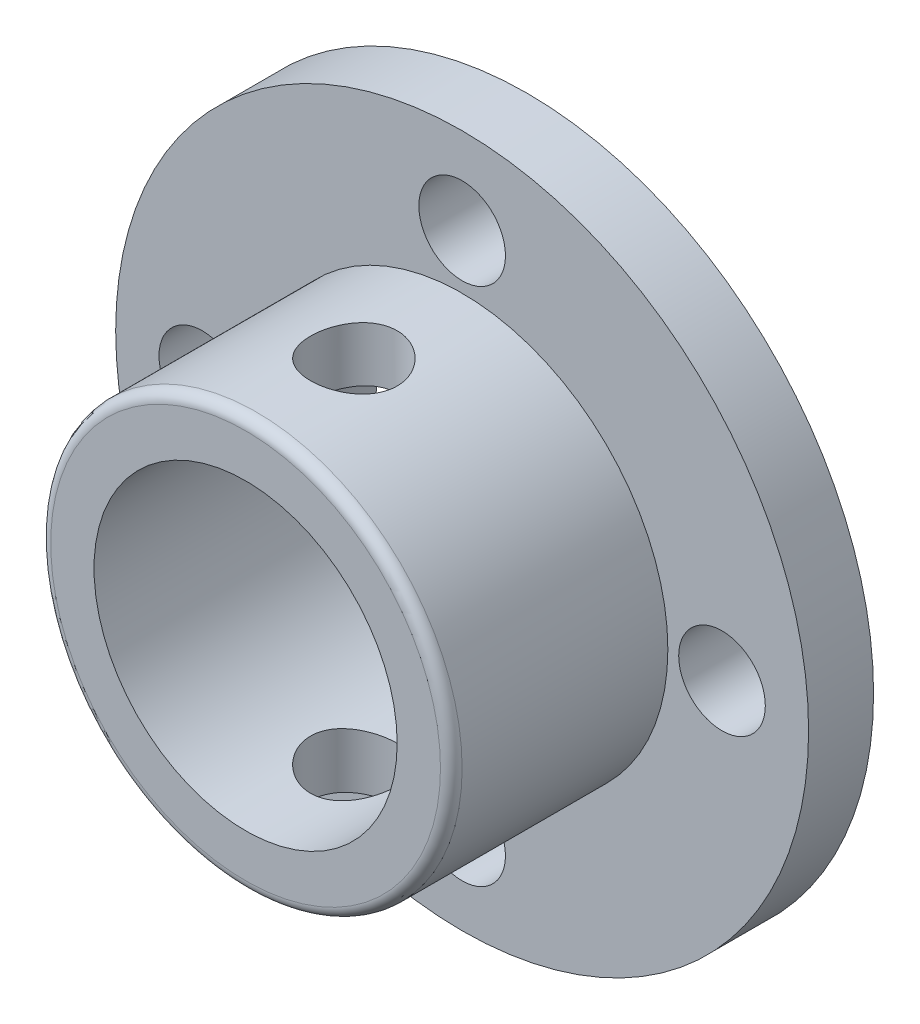
ISO-10303-21;
HEADER;
FILE_DESCRIPTION(('STEP AP214'),'2;1');
FILE_NAME('part.step','',(''),(''),'','','');
FILE_SCHEMA(('AUTOMOTIVE_DESIGN { 1 0 10303 214 1 1 1 1 }'));
ENDSEC;
DATA;
#1=APPLICATION_CONTEXT('core data for automotive mechanical design processes');
#2=APPLICATION_PROTOCOL_DEFINITION('international standard','automotive_design',2000,#1);
#3=PRODUCT_CONTEXT('',#1,'mechanical');
#4=PRODUCT('Part','Part','',(#3));
#5=PRODUCT_RELATED_PRODUCT_CATEGORY('part','',(#4));
#6=PRODUCT_DEFINITION_FORMATION('','',#4);
#7=PRODUCT_DEFINITION_CONTEXT('part definition',#1,'design');
#8=PRODUCT_DEFINITION('design','',#6,#7);
#9=PRODUCT_DEFINITION_SHAPE('','',#8);
#10=(LENGTH_UNIT() NAMED_UNIT(*) SI_UNIT(.MILLI.,.METRE.));
#11=(NAMED_UNIT(*) PLANE_ANGLE_UNIT() SI_UNIT($,.RADIAN.));
#12=(NAMED_UNIT(*) SI_UNIT($,.STERADIAN.) SOLID_ANGLE_UNIT());
#13=UNCERTAINTY_MEASURE_WITH_UNIT(LENGTH_MEASURE(1.E-05),#10,'distance_accuracy_value','');
#14=(GEOMETRIC_REPRESENTATION_CONTEXT(3) GLOBAL_UNCERTAINTY_ASSIGNED_CONTEXT((#13)) GLOBAL_UNIT_ASSIGNED_CONTEXT((#10,
#11,#12)) REPRESENTATION_CONTEXT('',''));
#15=CARTESIAN_POINT('',(0.,0.,0.));
#16=DIRECTION('',(0.,0.,1.));
#17=DIRECTION('',(1.,0.,0.));
#18=AXIS2_PLACEMENT_3D('',#15,#16,#17);
#19=CARTESIAN_POINT('',(0.,0.,3.));
#20=DIRECTION('',(0.,0.,-1.));
#21=DIRECTION('',(-1.,0.,0.));
#22=AXIS2_PLACEMENT_3D('',#19,#20,#21);
#23=CYLINDRICAL_SURFACE('',#22,16.);
#24=CARTESIAN_POINT('',(0.,0.,3.));
#25=DIRECTION('',(0.,0.,1.));
#26=DIRECTION('',(1.,0.,0.));
#27=AXIS2_PLACEMENT_3D('',#24,#25,#26);
#28=CIRCLE('',#27,16.);
#29=CARTESIAN_POINT('',(16.,0.,3.));
#30=VERTEX_POINT('',#29);
#31=EDGE_CURVE('E52',#30,#30,#28,.T.);
#32=ORIENTED_EDGE('',*,*,#31,.F.);
#33=EDGE_LOOP('',(#32));
#34=FACE_BOUND('',#33,.T.);
#35=CARTESIAN_POINT('',(0.,0.,0.));
#36=DIRECTION('',(0.,0.,1.));
#37=DIRECTION('',(1.,0.,0.));
#38=AXIS2_PLACEMENT_3D('',#35,#36,#37);
#39=CIRCLE('',#38,16.);
#40=CARTESIAN_POINT('',(16.,0.,0.));
#41=VERTEX_POINT('',#40);
#42=EDGE_CURVE('E118',#41,#41,#39,.T.);
#43=ORIENTED_EDGE('',*,*,#42,.T.);
#44=EDGE_LOOP('',(#43));
#45=FACE_BOUND('',#44,.T.);
#46=ADVANCED_FACE('F37',(#34,#45),#23,.T.);
#47=CARTESIAN_POINT('',(0.,0.,3.));
#48=DIRECTION('',(0.,0.,1.));
#49=DIRECTION('',(1.,0.,0.));
#50=AXIS2_PLACEMENT_3D('',#47,#48,#49);
#51=PLANE('',#50);
#52=CARTESIAN_POINT('',(-12.,0.,3.));
#53=DIRECTION('',(0.,0.,1.));
#54=DIRECTION('',(1.,0.,0.));
#55=AXIS2_PLACEMENT_3D('',#52,#53,#54);
#56=CIRCLE('',#55,2.);
#57=CARTESIAN_POINT('',(-10.,0.,3.));
#58=VERTEX_POINT('',#57);
#59=EDGE_CURVE('E127',#58,#58,#56,.T.);
#60=ORIENTED_EDGE('',*,*,#59,.F.);
#61=EDGE_LOOP('',(#60));
#62=FACE_BOUND('',#61,.T.);
#63=CARTESIAN_POINT('',(0.,-12.,3.));
#64=DIRECTION('',(0.,0.,1.));
#65=DIRECTION('',(1.,0.,0.));
#66=AXIS2_PLACEMENT_3D('',#63,#64,#65);
#67=CIRCLE('',#66,2.);
#68=CARTESIAN_POINT('',(2.,-12.,3.));
#69=VERTEX_POINT('',#68);
#70=EDGE_CURVE('E131',#69,#69,#67,.T.);
#71=ORIENTED_EDGE('',*,*,#70,.F.);
#72=EDGE_LOOP('',(#71));
#73=FACE_BOUND('',#72,.T.);
#74=CARTESIAN_POINT('',(12.,0.,3.));
#75=DIRECTION('',(0.,0.,1.));
#76=DIRECTION('',(1.,0.,0.));
#77=AXIS2_PLACEMENT_3D('',#74,#75,#76);
#78=CIRCLE('',#77,2.);
#79=CARTESIAN_POINT('',(14.,0.,3.));
#80=VERTEX_POINT('',#79);
#81=EDGE_CURVE('E134',#80,#80,#78,.T.);
#82=ORIENTED_EDGE('',*,*,#81,.F.);
#83=EDGE_LOOP('',(#82));
#84=FACE_BOUND('',#83,.T.);
#85=CARTESIAN_POINT('',(0.,12.,3.));
#86=DIRECTION('',(0.,0.,1.));
#87=DIRECTION('',(1.,0.,0.));
#88=AXIS2_PLACEMENT_3D('',#85,#86,#87);
#89=CIRCLE('',#88,2.);
#90=CARTESIAN_POINT('',(2.,12.,3.));
#91=VERTEX_POINT('',#90);
#92=EDGE_CURVE('E137',#91,#91,#89,.T.);
#93=ORIENTED_EDGE('',*,*,#92,.F.);
#94=EDGE_LOOP('',(#93));
#95=FACE_BOUND('',#94,.T.);
#96=CARTESIAN_POINT('',(0.,0.,3.));
#97=DIRECTION('',(0.,0.,1.));
#98=DIRECTION('',(1.,0.,0.));
#99=AXIS2_PLACEMENT_3D('',#96,#97,#98);
#100=CIRCLE('',#99,9.5);
#101=CARTESIAN_POINT('',(9.5,0.,3.));
#102=VERTEX_POINT('',#101);
#103=EDGE_CURVE('E48',#102,#102,#100,.T.);
#104=ORIENTED_EDGE('',*,*,#103,.F.);
#105=EDGE_LOOP('',(#104));
#106=FACE_BOUND('',#105,.T.);
#107=ORIENTED_EDGE('',*,*,#31,.T.);
#108=EDGE_LOOP('',(#107));
#109=FACE_BOUND('',#108,.T.);
#110=ADVANCED_FACE('F102',(#62,#73,#84,#95,#106,#109),#51,.T.);
#111=CARTESIAN_POINT('',(0.,0.,0.));
#112=DIRECTION('',(0.,0.,1.));
#113=DIRECTION('',(1.,0.,0.));
#114=AXIS2_PLACEMENT_3D('',#111,#112,#113);
#115=PLANE('',#114);
#116=CARTESIAN_POINT('',(-12.,0.,0.));
#117=DIRECTION('',(0.,0.,-1.));
#118=DIRECTION('',(-1.,0.,0.));
#119=AXIS2_PLACEMENT_3D('',#116,#117,#118);
#120=CIRCLE('',#119,2.);
#121=CARTESIAN_POINT('',(-14.,0.,0.));
#122=VERTEX_POINT('',#121);
#123=EDGE_CURVE('E140',#122,#122,#120,.T.);
#124=ORIENTED_EDGE('',*,*,#123,.F.);
#125=EDGE_LOOP('',(#124));
#126=FACE_BOUND('',#125,.T.);
#127=CARTESIAN_POINT('',(0.,-12.,0.));
#128=DIRECTION('',(0.,0.,-1.));
#129=DIRECTION('',(-1.,0.,0.));
#130=AXIS2_PLACEMENT_3D('',#127,#128,#129);
#131=CIRCLE('',#130,2.);
#132=CARTESIAN_POINT('',(-2.,-12.,0.));
#133=VERTEX_POINT('',#132);
#134=EDGE_CURVE('E147',#133,#133,#131,.T.);
#135=ORIENTED_EDGE('',*,*,#134,.F.);
#136=EDGE_LOOP('',(#135));
#137=FACE_BOUND('',#136,.T.);
#138=CARTESIAN_POINT('',(12.,0.,0.));
#139=DIRECTION('',(0.,0.,-1.));
#140=DIRECTION('',(-1.,0.,0.));
#141=AXIS2_PLACEMENT_3D('',#138,#139,#140);
#142=CIRCLE('',#141,2.);
#143=CARTESIAN_POINT('',(10.,0.,0.));
#144=VERTEX_POINT('',#143);
#145=EDGE_CURVE('E144',#144,#144,#142,.T.);
#146=ORIENTED_EDGE('',*,*,#145,.F.);
#147=EDGE_LOOP('',(#146));
#148=FACE_BOUND('',#147,.T.);
#149=CARTESIAN_POINT('',(0.,12.,0.));
#150=DIRECTION('',(0.,0.,-1.));
#151=DIRECTION('',(-1.,0.,0.));
#152=AXIS2_PLACEMENT_3D('',#149,#150,#151);
#153=CIRCLE('',#152,2.);
#154=CARTESIAN_POINT('',(-2.,12.,0.));
#155=VERTEX_POINT('',#154);
#156=EDGE_CURVE('E141',#155,#155,#153,.T.);
#157=ORIENTED_EDGE('',*,*,#156,.F.);
#158=EDGE_LOOP('',(#157));
#159=FACE_BOUND('',#158,.T.);
#160=CARTESIAN_POINT('',(0.,0.,0.));
#161=DIRECTION('',(0.,0.,1.));
#162=DIRECTION('',(1.,0.,0.));
#163=AXIS2_PLACEMENT_3D('',#160,#161,#162);
#164=CIRCLE('',#163,7.);
#165=CARTESIAN_POINT('',(7.,0.,0.));
#166=VERTEX_POINT('',#165);
#167=EDGE_CURVE('E120',#166,#166,#164,.T.);
#168=ORIENTED_EDGE('',*,*,#167,.T.);
#169=EDGE_LOOP('',(#168));
#170=FACE_BOUND('',#169,.T.);
#171=ORIENTED_EDGE('',*,*,#42,.F.);
#172=EDGE_LOOP('',(#171));
#173=FACE_BOUND('',#172,.T.);
#174=ADVANCED_FACE('F101',(#126,#137,#148,#159,#170,#173),#115,.F.);
#175=CARTESIAN_POINT('',(0.,0.,13.));
#176=DIRECTION('',(0.,0.,-1.));
#177=DIRECTION('',(-1.,0.,0.));
#178=AXIS2_PLACEMENT_3D('',#175,#176,#177);
#179=CYLINDRICAL_SURFACE('',#178,9.5);
#180=CARTESIAN_POINT('',(0.,0.,12.5));
#181=DIRECTION('',(0.,0.,1.));
#182=DIRECTION('',(1.,0.,0.));
#183=AXIS2_PLACEMENT_3D('',#180,#181,#182);
#184=CIRCLE('',#183,9.5);
#185=CARTESIAN_POINT('',(9.5,0.,12.5));
#186=VERTEX_POINT('',#185);
#187=EDGE_CURVE('E10',#186,#186,#184,.F.);
#188=ORIENTED_EDGE('',*,*,#187,.T.);
#189=EDGE_LOOP('',(#188));
#190=FACE_BOUND('',#189,.T.);
#191=CARTESIAN_POINT('',(0.,-9.5,10.));
#192=CARTESIAN_POINT('',(0.111027691406918,-9.49999794466284,9.99999607124184));
#193=CARTESIAN_POINT('',(0.222103819697907,-9.49803374011152,9.99072341258494));
#194=CARTESIAN_POINT('',(0.441107897677741,-9.49038773876543,9.95391221577523));
#195=CARTESIAN_POINT('',(0.54903342154803,-9.48470315241122,9.92635997129166));
#196=CARTESIAN_POINT('',(0.75853895435663,-9.47025014436966,9.85388532469073));
#197=CARTESIAN_POINT('',(0.860125227252473,-9.46148482551806,9.80898039524809));
#198=CARTESIAN_POINT('',(1.05431669556347,-9.44181943917345,9.7031289600956));
#199=CARTESIAN_POINT('',(1.14692225767425,-9.43091945889674,9.64218310973783));
#200=CARTESIAN_POINT('',(1.32191105664779,-9.40799939900276,9.5050163164218));
#201=CARTESIAN_POINT('',(1.40414098477696,-9.39596628673028,9.42860195147082));
#202=CARTESIAN_POINT('',(1.5547158009156,-9.37222932526175,9.26308274811662));
#203=CARTESIAN_POINT('',(1.62305952179986,-9.36052550381352,9.17397684406892));
#204=CARTESIAN_POINT('',(1.74458761331518,-9.33864435582616,8.98448418595307));
#205=CARTESIAN_POINT('',(1.79761077433325,-9.3284837610875,8.88399193875563));
#206=CARTESIAN_POINT('',(1.88595912909311,-9.31102569552844,8.67527480153637));
#207=CARTESIAN_POINT('',(1.92128627263874,-9.30372790929388,8.56705076492994));
#208=CARTESIAN_POINT('',(1.97273711798376,-9.29295410063532,8.34759918793632));
#209=CARTESIAN_POINT('',(1.98913117149676,-9.28942433018121,8.23643772602986));
#210=CARTESIAN_POINT('',(2.00309070126667,-9.28642462929545,8.01289040972181));
#211=CARTESIAN_POINT('',(2.0006583162811,-9.28695423770231,7.90050469584858));
#212=CARTESIAN_POINT('',(1.97725203465241,-9.29196471678557,7.67969454311813));
#213=CARTESIAN_POINT('',(1.95659032965632,-9.29637905513068,7.57123527450766));
#214=CARTESIAN_POINT('',(1.89780570602233,-9.30855661318396,7.35935778687936));
#215=CARTESIAN_POINT('',(1.85968187273537,-9.31632000831117,7.25593983223457));
#216=CARTESIAN_POINT('',(1.76676342524457,-9.3343876042841,7.05619311586893));
#217=CARTESIAN_POINT('',(1.71184711583088,-9.34471024508934,6.95992270171329));
#218=CARTESIAN_POINT('',(1.58698828724243,-9.36672168799341,6.77784720736976));
#219=CARTESIAN_POINT('',(1.51704386320572,-9.37841066319381,6.6920434560286));
#220=CARTESIAN_POINT('',(1.36245319268555,-9.40212443418224,6.5315377182517));
#221=CARTESIAN_POINT('',(1.27754103078861,-9.41415127237563,6.45709191372292));
#222=CARTESIAN_POINT('',(1.09630350618647,-9.43697235772124,6.32345749428508));
#223=CARTESIAN_POINT('',(0.999977965203845,-9.44776658561488,6.26426911774351));
#224=CARTESIAN_POINT('',(0.798347946602957,-9.4669373217246,6.16277357067253));
#225=CARTESIAN_POINT('',(0.693027080487019,-9.47530928967255,6.12049804546326));
#226=CARTESIAN_POINT('',(0.476561722422704,-9.48865817597072,6.05431411167284));
#227=CARTESIAN_POINT('',(0.365418015870041,-9.49363555092699,6.0304032328119));
#228=CARTESIAN_POINT('',(0.142661179143838,-9.49957007213675,6.00199549360385));
#229=CARTESIAN_POINT('',(0.0310945881093405,-9.50059973479178,5.9971484028368));
#230=CARTESIAN_POINT('',(-0.191254168004883,-9.49872522451051,6.00605926966534));
#231=CARTESIAN_POINT('',(-0.302036381746438,-9.49582129779749,6.01981606274954));
#232=CARTESIAN_POINT('',(-0.518524951939024,-9.48645148769872,6.06525350407423));
#233=CARTESIAN_POINT('',(-0.624271191689803,-9.48002177185877,6.0967522431248));
#234=CARTESIAN_POINT('',(-0.828980163564159,-9.46431934896414,6.17657893621449));
#235=CARTESIAN_POINT('',(-0.927942347168736,-9.45504641235425,6.22490824915882));
#236=CARTESIAN_POINT('',(-1.1177352139125,-9.43450639350327,6.33776641280824));
#237=CARTESIAN_POINT('',(-1.20843942082223,-9.42321429613729,6.40250330603654));
#238=CARTESIAN_POINT('',(-1.3778228093732,-9.39994292264559,6.5460629854693));
#239=CARTESIAN_POINT('',(-1.45650054987901,-9.38796356440136,6.62488745734182));
#240=CARTESIAN_POINT('',(-1.60096761890465,-9.36442002668555,6.79598635775441));
#241=CARTESIAN_POINT('',(-1.66651533299618,-9.35286635532255,6.88846649855883));
#242=CARTESIAN_POINT('',(-1.78114871532168,-9.3317158615554,7.08332921929841));
#243=CARTESIAN_POINT('',(-1.83023507526624,-9.32211895693401,7.1857113829149));
#244=CARTESIAN_POINT('',(-1.91023404895235,-9.30605568943114,7.39693504714075));
#245=CARTESIAN_POINT('',(-1.94124569603787,-9.29957230236649,7.50573768219553));
#246=CARTESIAN_POINT('',(-1.98450997561557,-9.29043690813401,7.72716231931549));
#247=CARTESIAN_POINT('',(-1.99676535636039,-9.2877843396606,7.83978375935983));
#248=CARTESIAN_POINT('',(-2.00205901839309,-9.28664441918933,8.06321772699636));
#249=CARTESIAN_POINT('',(-1.99547977904066,-9.28807416506268,8.17402094367414));
#250=CARTESIAN_POINT('',(-1.96414112828371,-9.29475130102582,8.39290256994455));
#251=CARTESIAN_POINT('',(-1.93938189936145,-9.29999865279627,8.50098100687599));
#252=CARTESIAN_POINT('',(-1.87256463307709,-9.31368082515299,8.71106838455512));
#253=CARTESIAN_POINT('',(-1.83055834216923,-9.32210610488688,8.81309444519955));
#254=CARTESIAN_POINT('',(-1.7304853373043,-9.34119928093713,9.00870903307655));
#255=CARTESIAN_POINT('',(-1.67241709412298,-9.35186739076535,9.10229675578741));
#256=CARTESIAN_POINT('',(-1.54058300352461,-9.37449454781844,9.28027215313688));
#257=CARTESIAN_POINT('',(-1.46654292423916,-9.38647407045747,9.36445412742039));
#258=CARTESIAN_POINT('',(-1.30542742412966,-9.41023256612317,9.51932471088922));
#259=CARTESIAN_POINT('',(-1.21834900426412,-9.42201149231316,9.59001020712048));
#260=CARTESIAN_POINT('',(-1.0323889870608,-9.44420645110714,9.71667699825411));
#261=CARTESIAN_POINT('',(-0.933379984354339,-9.45460471891947,9.77247451681065));
#262=CARTESIAN_POINT('',(-0.727194538068345,-9.47269018370409,9.86654901797898));
#263=CARTESIAN_POINT('',(-0.620025269870786,-9.48037972974824,9.90484119029407));
#264=CARTESIAN_POINT('',(-0.427239257105932,-9.49075437069452,9.95572669428031));
#265=CARTESIAN_POINT('',(-0.34269090067951,-9.4942005429971,9.97229845081316));
#266=CARTESIAN_POINT('',(-0.172104693356146,-9.49882411071615,9.99443641509507));
#267=CARTESIAN_POINT('',(-0.0860668997910729,-9.50000159326466,10.0000030455108));
#268=CARTESIAN_POINT('',(0.,-9.5,10.));
#269=B_SPLINE_CURVE_WITH_KNOTS('',3,(#191,#192,#193,#194,#195,#196,#197,#198,#199,#200,#201,
#202,#203,#204,#205,#206,#207,#208,#209,#210,#211,#212,#213,#214,#215,#216,#217,#218,#219,#220,
#221,#222,#223,#224,#225,#226,#227,#228,#229,#230,#231,#232,#233,#234,#235,#236,#237,#238,#239,
#240,#241,#242,#243,#244,#245,#246,#247,#248,#249,#250,#251,#252,#253,#254,#255,#256,#257,#258,
#259,#260,#261,#262,#263,#264,#265,#266,#267,#268),.UNSPECIFIED.,.T.,.F.,(4,2,2,2,2,2,2,2,2,2,2,
2,2,2,2,2,2,2,2,2,2,2,2,2,2,2,2,2,2,2,2,2,2,2,2,2,2,2,4),(0.,0.332768117031277,
0.665786031430694,0.998469495255917,1.33113936940165,1.6682591973254,2.00540734820485,
2.34598369082386,2.68652249939278,3.02213605752824,3.35771148920196,3.68764911424787,
4.01760402307771,4.35000918418411,4.68245650359801,5.02154876866119,5.36064633105724,
5.7003754379772,6.04005883898082,6.37347176163493,6.7068638152502,7.03689822691305,
7.36695929182639,7.70143535229663,8.03595146177539,8.37614947767226,8.71633319656386,
9.05463505055367,9.39288733028468,9.72431965754211,10.0557486580815,10.3861904535976,
10.7166637206083,11.0533410961237,11.3900960325031,11.7308334079191,12.0712745555643,
12.329241012877,12.5871975624483),.UNSPECIFIED.);
#270=CARTESIAN_POINT('',(0.,-9.5,10.));
#271=VERTEX_POINT('',#270);
#272=EDGE_CURVE('E91',#271,#271,#269,.T.);
#273=ORIENTED_EDGE('',*,*,#272,.T.);
#274=EDGE_LOOP('',(#273));
#275=FACE_BOUND('',#274,.T.);
#276=CARTESIAN_POINT('',(0.,9.5,10.));
#277=CARTESIAN_POINT('',(-0.111027691406918,9.49999794466284,9.99999607124184));
#278=CARTESIAN_POINT('',(-0.222103819697907,9.49803374011152,9.99072341258494));
#279=CARTESIAN_POINT('',(-0.441107897677741,9.49038773876543,9.95391221577523));
#280=CARTESIAN_POINT('',(-0.54903342154803,9.48470315241122,9.92635997129166));
#281=CARTESIAN_POINT('',(-0.75853895435663,9.47025014436966,9.85388532469073));
#282=CARTESIAN_POINT('',(-0.860125227252473,9.46148482551806,9.80898039524809));
#283=CARTESIAN_POINT('',(-1.05431669556347,9.44181943917345,9.7031289600956));
#284=CARTESIAN_POINT('',(-1.14692225767425,9.43091945889674,9.64218310973783));
#285=CARTESIAN_POINT('',(-1.32191105664779,9.40799939900276,9.5050163164218));
#286=CARTESIAN_POINT('',(-1.40414098477696,9.39596628673028,9.42860195147082));
#287=CARTESIAN_POINT('',(-1.5547158009156,9.37222932526175,9.26308274811662));
#288=CARTESIAN_POINT('',(-1.62305952179986,9.36052550381352,9.17397684406892));
#289=CARTESIAN_POINT('',(-1.74458761331518,9.33864435582616,8.98448418595307));
#290=CARTESIAN_POINT('',(-1.79761077433325,9.3284837610875,8.88399193875563));
#291=CARTESIAN_POINT('',(-1.88595912909311,9.31102569552844,8.67527480153637));
#292=CARTESIAN_POINT('',(-1.92128627263874,9.30372790929388,8.56705076492994));
#293=CARTESIAN_POINT('',(-1.97273711798376,9.29295410063532,8.34759918793632));
#294=CARTESIAN_POINT('',(-1.98913117149676,9.28942433018121,8.23643772602986));
#295=CARTESIAN_POINT('',(-2.00309070126667,9.28642462929545,8.01289040972181));
#296=CARTESIAN_POINT('',(-2.0006583162811,9.28695423770231,7.90050469584858));
#297=CARTESIAN_POINT('',(-1.97725203465241,9.29196471678557,7.67969454311813));
#298=CARTESIAN_POINT('',(-1.95659032965632,9.29637905513068,7.57123527450766));
#299=CARTESIAN_POINT('',(-1.89780570602233,9.30855661318396,7.35935778687936));
#300=CARTESIAN_POINT('',(-1.85968187273537,9.31632000831117,7.25593983223457));
#301=CARTESIAN_POINT('',(-1.76676342524457,9.3343876042841,7.05619311586893));
#302=CARTESIAN_POINT('',(-1.71184711583088,9.34471024508934,6.95992270171329));
#303=CARTESIAN_POINT('',(-1.58698828724243,9.36672168799341,6.77784720736976));
#304=CARTESIAN_POINT('',(-1.51704386320572,9.37841066319381,6.6920434560286));
#305=CARTESIAN_POINT('',(-1.36245319268555,9.40212443418224,6.5315377182517));
#306=CARTESIAN_POINT('',(-1.27754103078861,9.41415127237563,6.45709191372292));
#307=CARTESIAN_POINT('',(-1.09630350618647,9.43697235772124,6.32345749428508));
#308=CARTESIAN_POINT('',(-0.999977965203845,9.44776658561488,6.26426911774351));
#309=CARTESIAN_POINT('',(-0.798347946602957,9.4669373217246,6.16277357067253));
#310=CARTESIAN_POINT('',(-0.693027080487019,9.47530928967255,6.12049804546326));
#311=CARTESIAN_POINT('',(-0.476561722422704,9.48865817597072,6.05431411167284));
#312=CARTESIAN_POINT('',(-0.365418015870041,9.49363555092699,6.0304032328119));
#313=CARTESIAN_POINT('',(-0.142661179143838,9.49957007213675,6.00199549360385));
#314=CARTESIAN_POINT('',(-0.0310945881093405,9.50059973479178,5.9971484028368));
#315=CARTESIAN_POINT('',(0.191254168004883,9.49872522451051,6.00605926966534));
#316=CARTESIAN_POINT('',(0.302036381746438,9.49582129779749,6.01981606274954));
#317=CARTESIAN_POINT('',(0.518524951939024,9.48645148769872,6.06525350407423));
#318=CARTESIAN_POINT('',(0.624271191689803,9.48002177185877,6.0967522431248));
#319=CARTESIAN_POINT('',(0.828980163564159,9.46431934896414,6.17657893621449));
#320=CARTESIAN_POINT('',(0.927942347168736,9.45504641235425,6.22490824915882));
#321=CARTESIAN_POINT('',(1.1177352139125,9.43450639350327,6.33776641280824));
#322=CARTESIAN_POINT('',(1.20843942082223,9.42321429613729,6.40250330603654));
#323=CARTESIAN_POINT('',(1.3778228093732,9.39994292264559,6.5460629854693));
#324=CARTESIAN_POINT('',(1.45650054987901,9.38796356440136,6.62488745734182));
#325=CARTESIAN_POINT('',(1.60096761890465,9.36442002668555,6.79598635775441));
#326=CARTESIAN_POINT('',(1.66651533299618,9.35286635532255,6.88846649855883));
#327=CARTESIAN_POINT('',(1.78114871532168,9.3317158615554,7.08332921929841));
#328=CARTESIAN_POINT('',(1.83023507526624,9.32211895693401,7.1857113829149));
#329=CARTESIAN_POINT('',(1.91023404895235,9.30605568943114,7.39693504714075));
#330=CARTESIAN_POINT('',(1.94124569603787,9.29957230236649,7.50573768219553));
#331=CARTESIAN_POINT('',(1.98450997561557,9.29043690813401,7.72716231931549));
#332=CARTESIAN_POINT('',(1.99676535636039,9.2877843396606,7.83978375935983));
#333=CARTESIAN_POINT('',(2.00205901839309,9.28664441918933,8.06321772699636));
#334=CARTESIAN_POINT('',(1.99547977904066,9.28807416506268,8.17402094367414));
#335=CARTESIAN_POINT('',(1.96414112828371,9.29475130102582,8.39290256994455));
#336=CARTESIAN_POINT('',(1.93938189936145,9.29999865279627,8.50098100687599));
#337=CARTESIAN_POINT('',(1.87256463307709,9.31368082515299,8.71106838455512));
#338=CARTESIAN_POINT('',(1.83055834216923,9.32210610488688,8.81309444519955));
#339=CARTESIAN_POINT('',(1.7304853373043,9.34119928093713,9.00870903307655));
#340=CARTESIAN_POINT('',(1.67241709412298,9.35186739076535,9.10229675578741));
#341=CARTESIAN_POINT('',(1.54058300352461,9.37449454781844,9.28027215313688));
#342=CARTESIAN_POINT('',(1.46654292423916,9.38647407045747,9.36445412742039));
#343=CARTESIAN_POINT('',(1.30542742412966,9.41023256612317,9.51932471088922));
#344=CARTESIAN_POINT('',(1.21834900426412,9.42201149231316,9.59001020712048));
#345=CARTESIAN_POINT('',(1.0323889870608,9.44420645110714,9.71667699825411));
#346=CARTESIAN_POINT('',(0.933379984354339,9.45460471891947,9.77247451681065));
#347=CARTESIAN_POINT('',(0.727194538068345,9.47269018370409,9.86654901797898));
#348=CARTESIAN_POINT('',(0.620025269870786,9.48037972974824,9.90484119029407));
#349=CARTESIAN_POINT('',(0.427239257105932,9.49075437069452,9.95572669428031));
#350=CARTESIAN_POINT('',(0.34269090067951,9.4942005429971,9.97229845081316));
#351=CARTESIAN_POINT('',(0.172104693356146,9.49882411071615,9.99443641509507));
#352=CARTESIAN_POINT('',(0.0860668997910729,9.50000159326466,10.0000030455108));
#353=CARTESIAN_POINT('',(0.,9.5,10.));
#354=B_SPLINE_CURVE_WITH_KNOTS('',3,(#276,#277,#278,#279,#280,#281,#282,#283,#284,#285,#286,
#287,#288,#289,#290,#291,#292,#293,#294,#295,#296,#297,#298,#299,#300,#301,#302,#303,#304,#305,
#306,#307,#308,#309,#310,#311,#312,#313,#314,#315,#316,#317,#318,#319,#320,#321,#322,#323,#324,
#325,#326,#327,#328,#329,#330,#331,#332,#333,#334,#335,#336,#337,#338,#339,#340,#341,#342,#343,
#344,#345,#346,#347,#348,#349,#350,#351,#352,#353),.UNSPECIFIED.,.T.,.F.,(4,2,2,2,2,2,2,2,2,2,2,
2,2,2,2,2,2,2,2,2,2,2,2,2,2,2,2,2,2,2,2,2,2,2,2,2,2,2,4),(0.,0.332768117031277,
0.665786031430694,0.998469495255917,1.33113936940165,1.6682591973254,2.00540734820485,
2.34598369082386,2.68652249939278,3.02213605752824,3.35771148920196,3.68764911424787,
4.01760402307771,4.35000918418411,4.68245650359801,5.02154876866119,5.36064633105724,
5.7003754379772,6.04005883898082,6.37347176163493,6.7068638152502,7.03689822691305,
7.36695929182639,7.70143535229663,8.03595146177539,8.37614947767226,8.71633319656386,
9.05463505055367,9.39288733028468,9.72431965754211,10.0557486580815,10.3861904535976,
10.7166637206083,11.0533410961237,11.3900960325031,11.7308334079191,12.0712745555643,
12.329241012877,12.5871975624483),.UNSPECIFIED.);
#355=CARTESIAN_POINT('',(0.,9.5,10.));
#356=VERTEX_POINT('',#355);
#357=EDGE_CURVE('E63',#356,#356,#354,.T.);
#358=ORIENTED_EDGE('',*,*,#357,.T.);
#359=EDGE_LOOP('',(#358));
#360=FACE_BOUND('',#359,.T.);
#361=ORIENTED_EDGE('',*,*,#103,.T.);
#362=EDGE_LOOP('',(#361));
#363=FACE_BOUND('',#362,.T.);
#364=ADVANCED_FACE('F96',(#190,#275,#360,#363),#179,.T.);
#365=CARTESIAN_POINT('',(0.,0.,13.));
#366=DIRECTION('',(0.,0.,1.));
#367=DIRECTION('',(1.,0.,0.));
#368=AXIS2_PLACEMENT_3D('',#365,#366,#367);
#369=PLANE('',#368);
#370=CARTESIAN_POINT('',(0.,0.,13.));
#371=DIRECTION('',(0.,0.,1.));
#372=DIRECTION('',(1.,0.,0.));
#373=AXIS2_PLACEMENT_3D('',#370,#371,#372);
#374=CIRCLE('',#373,9.);
#375=CARTESIAN_POINT('',(9.,0.,13.));
#376=VERTEX_POINT('',#375);
#377=EDGE_CURVE('E44',#376,#376,#374,.T.);
#378=ORIENTED_EDGE('',*,*,#377,.T.);
#379=EDGE_LOOP('',(#378));
#380=FACE_BOUND('',#379,.T.);
#381=CARTESIAN_POINT('',(0.,0.,13.));
#382=DIRECTION('',(0.,0.,1.));
#383=DIRECTION('',(1.,0.,0.));
#384=AXIS2_PLACEMENT_3D('',#381,#382,#383);
#385=CIRCLE('',#384,7.);
#386=CARTESIAN_POINT('',(7.,0.,13.));
#387=VERTEX_POINT('',#386);
#388=EDGE_CURVE('E123',#387,#387,#385,.T.);
#389=ORIENTED_EDGE('',*,*,#388,.F.);
#390=EDGE_LOOP('',(#389));
#391=FACE_BOUND('',#390,.T.);
#392=ADVANCED_FACE('F100',(#380,#391),#369,.T.);
#393=CARTESIAN_POINT('',(0.,0.,0.));
#394=DIRECTION('',(0.,0.,1.));
#395=DIRECTION('',(1.,0.,0.));
#396=AXIS2_PLACEMENT_3D('',#393,#394,#395);
#397=CYLINDRICAL_SURFACE('',#396,7.);
#398=CARTESIAN_POINT('',(0.,-7.,10.));
#399=CARTESIAN_POINT('',(-0.109954902377251,-6.99999869294341,9.99999806043805));
#400=CARTESIAN_POINT('',(-0.219929747872582,-6.99738417402043,9.99090221102388));
#401=CARTESIAN_POINT('',(-0.436691991196989,-6.98720905945103,9.95483572989769));
#402=CARTESIAN_POINT('',(-0.543478166829616,-6.97964659210084,9.92785833392591));
#403=CARTESIAN_POINT('',(-0.750704300737871,-6.96040691349073,9.85699196158349));
#404=CARTESIAN_POINT('',(-0.851152880848224,-6.94873544106341,9.81312656384805));
#405=CARTESIAN_POINT('',(-1.04326876112927,-6.92249978316544,9.70982200852165));
#406=CARTESIAN_POINT('',(-1.13493514117817,-6.90793529508022,9.65038122150964));
#407=CARTESIAN_POINT('',(-1.30929444685895,-6.8770473462558,9.51596498932709));
#408=CARTESIAN_POINT('',(-1.39172372238094,-6.86069041945191,9.44065524614473));
#409=CARTESIAN_POINT('',(-1.54297135792435,-6.82826734915641,9.27735225686232));
#410=CARTESIAN_POINT('',(-1.61178767707782,-6.81220124959344,9.18935711236777));
#411=CARTESIAN_POINT('',(-1.7351979000643,-6.78183014875388,9.00100641720909));
#412=CARTESIAN_POINT('',(-1.78947821103348,-6.76756702506018,8.90043801493514));
#413=CARTESIAN_POINT('',(-1.8802517055398,-6.74291343840667,8.69112798824924));
#414=CARTESIAN_POINT('',(-1.91674871555719,-6.73252214244871,8.58238812792911));
#415=CARTESIAN_POINT('',(-1.96998433013875,-6.71713608196016,8.36276523683446));
#416=CARTESIAN_POINT('',(-1.9872055320285,-6.71200978570011,8.25200863723217));
#417=CARTESIAN_POINT('',(-2.00290667789184,-6.70734208201995,8.0290688515539));
#418=CARTESIAN_POINT('',(-2.00139069409621,-6.70779946107612,7.91688598074978));
#419=CARTESIAN_POINT('',(-1.98004134762903,-6.71413034409934,7.69813138854384));
#420=CARTESIAN_POINT('',(-1.96080325728391,-6.71982782697936,7.59149564881924));
#421=CARTESIAN_POINT('',(-1.90551386085789,-6.73571348382811,7.3830327803724));
#422=CARTESIAN_POINT('',(-1.8694610348125,-6.74590206376403,7.2812060872795));
#423=CARTESIAN_POINT('',(-1.78110681137812,-6.7697686351608,7.08375375556819));
#424=CARTESIAN_POINT('',(-1.72860551172881,-6.78348916405649,6.98822292759833));
#425=CARTESIAN_POINT('',(-1.60898379167885,-6.81285216882059,6.80712343878659));
#426=CARTESIAN_POINT('',(-1.54186011673345,-6.82849507221912,6.72155700226509));
#427=CARTESIAN_POINT('',(-1.39190399673021,-6.86066250656356,6.55942762439363));
#428=CARTESIAN_POINT('',(-1.30857487484533,-6.87719804572366,6.48332552403277));
#429=CARTESIAN_POINT('',(-1.13013228238622,-6.90876247218345,6.34607399635972));
#430=CARTESIAN_POINT('',(-1.03501820148189,-6.92379128137825,6.28492534395829));
#431=CARTESIAN_POINT('',(-0.834923073091444,-6.95076528065502,6.17907126522596));
#432=CARTESIAN_POINT('',(-0.729889817810004,-6.96269275497229,6.13445971319581));
#433=CARTESIAN_POINT('',(-0.513393229967468,-6.98199251487585,6.06366610858318));
#434=CARTESIAN_POINT('',(-0.401931525810145,-6.98936594856255,6.03747941075473));
#435=CARTESIAN_POINT('',(-0.179666388644349,-6.99854874514672,6.00502671429055));
#436=CARTESIAN_POINT('',(-0.068961346860507,-7.00053272850599,5.99813530462697));
#437=CARTESIAN_POINT('',(0.152026526805584,-6.99922084707091,6.00272726630104));
#438=CARTESIAN_POINT('',(0.262309407757109,-6.99592561580629,6.01420843284592));
#439=CARTESIAN_POINT('',(0.477018633430315,-6.98453926685206,6.05471044431625));
#440=CARTESIAN_POINT('',(0.581518211734843,-6.97654613017679,6.08337318132339));
#441=CARTESIAN_POINT('',(0.784208686205641,-6.95667998741883,6.15700050198467));
#442=CARTESIAN_POINT('',(0.882398851248718,-6.94480653265874,6.20196697088933));
#443=CARTESIAN_POINT('',(1.07204168512003,-6.91809961169145,6.30802333664512));
#444=CARTESIAN_POINT('',(1.16330248654009,-6.9032076317834,6.36944119882533));
#445=CARTESIAN_POINT('',(1.33443852805947,-6.87217947098441,6.5062525059511));
#446=CARTESIAN_POINT('',(1.41431117084304,-6.85604300755107,6.58164913006457));
#447=CARTESIAN_POINT('',(1.56310642834007,-6.82368619629443,6.74720934204944));
#448=CARTESIAN_POINT('',(1.63158542740713,-6.80748036858305,6.83777527555905));
#449=CARTESIAN_POINT('',(1.75239531606757,-6.77738894734786,7.02946258862467));
#450=CARTESIAN_POINT('',(1.8047267674867,-6.76350327310608,7.13058360077126));
#451=CARTESIAN_POINT('',(1.89137454118278,-6.73978651242836,7.34009121097521));
#452=CARTESIAN_POINT('',(1.92578633239654,-6.72993400029434,7.44843576349761));
#453=CARTESIAN_POINT('',(1.9757945006787,-6.71542456669526,7.66970993557479));
#454=CARTESIAN_POINT('',(1.99139657901587,-6.71076607094366,7.78263815507641));
#455=CARTESIAN_POINT('',(2.00298024246851,-6.70731703127619,8.00529603293678));
#456=CARTESIAN_POINT('',(1.99968027644405,-6.70831160808103,8.11498550455666));
#457=CARTESIAN_POINT('',(1.97524710957466,-6.71554597206102,8.33217473066169));
#458=CARTESIAN_POINT('',(1.95411450379873,-6.72178558421114,8.43967455809192));
#459=CARTESIAN_POINT('',(1.89505968816675,-6.73866977160527,8.6483783711686));
#460=CARTESIAN_POINT('',(1.85731091786365,-6.74926877048974,8.74963538701117));
#461=CARTESIAN_POINT('',(1.76622949301581,-6.77367302842112,8.9444587344922));
#462=CARTESIAN_POINT('',(1.71289408043152,-6.78747885482392,9.03802370127323));
#463=CARTESIAN_POINT('',(1.59006546534828,-6.81731668949935,9.21818352180533));
#464=CARTESIAN_POINT('',(1.52009227722732,-6.83340763179064,9.30444139134196));
#465=CARTESIAN_POINT('',(1.36685984037934,-6.86569845092232,9.46422389580981));
#466=CARTESIAN_POINT('',(1.28359725072856,-6.88189835417168,9.5377453191108));
#467=CARTESIAN_POINT('',(1.10357432086539,-6.91307959572365,9.67183718432662));
#468=CARTESIAN_POINT('',(1.00652250235978,-6.92801901037413,9.73202698726963));
#469=CARTESIAN_POINT('',(0.803250529646658,-6.95451395777971,9.83514578502201));
#470=CARTESIAN_POINT('',(0.697035424114737,-6.96607133870287,9.87808421193307));
#471=CARTESIAN_POINT('',(0.492916315335032,-6.98327344725308,9.94084755139545));
#472=CARTESIAN_POINT('',(0.395763007624388,-6.98949684362076,9.96297353668456));
#473=CARTESIAN_POINT('',(0.199078368786366,-6.99786043852147,9.99254965724214));
#474=CARTESIAN_POINT('',(0.099547357616091,-7.00000118333996,10.0000017559769));
#475=CARTESIAN_POINT('',(0.,-7.,10.));
#476=B_SPLINE_CURVE_WITH_KNOTS('',3,(#398,#399,#400,#401,#402,#403,#404,#405,#406,#407,#408,
#409,#410,#411,#412,#413,#414,#415,#416,#417,#418,#419,#420,#421,#422,#423,#424,#425,#426,#427,
#428,#429,#430,#431,#432,#433,#434,#435,#436,#437,#438,#439,#440,#441,#442,#443,#444,#445,#446,
#447,#448,#449,#450,#451,#452,#453,#454,#455,#456,#457,#458,#459,#460,#461,#462,#463,#464,#465,
#466,#467,#468,#469,#470,#471,#472,#473,#474,#475),.UNSPECIFIED.,.T.,.F.,(4,2,2,2,2,2,2,2,2,2,2,
2,2,2,2,2,2,2,2,2,2,2,2,2,2,2,2,2,2,2,2,2,2,2,2,2,2,2,4),(0.,0.329499312542344,0.65912333979518,
0.988288812895344,1.31748873543516,1.65447811530781,1.99151797873713,2.33533075300057,
2.67906951544809,3.0139950986275,3.34884789231233,3.67284785829333,3.99687711786126,
4.3250080329121,4.65321205577343,4.99378500602502,5.33437560155449,5.67687101104449,
6.01928004014612,6.350454576982,6.68158937434648,7.00605140479519,7.33055096575529,
7.66207525344451,7.99367503187787,8.33612104884334,8.67855514965298,9.01914573366138,
9.35963305787734,9.68726681616472,10.0148896418598,10.3391709629126,10.6635096999758,
10.9986765689036,11.3339278310847,11.6777797897016,12.0214434923409,12.3197946803794,
12.6181059442772),.UNSPECIFIED.);
#477=CARTESIAN_POINT('',(0.,-7.,10.));
#478=VERTEX_POINT('',#477);
#479=EDGE_CURVE('E55',#478,#478,#476,.T.);
#480=ORIENTED_EDGE('',*,*,#479,.T.);
#481=EDGE_LOOP('',(#480));
#482=FACE_BOUND('',#481,.T.);
#483=CARTESIAN_POINT('',(0.,7.,10.));
#484=CARTESIAN_POINT('',(0.109954902377251,6.99999869294341,9.99999806043805));
#485=CARTESIAN_POINT('',(0.219929747872582,6.99738417402043,9.99090221102388));
#486=CARTESIAN_POINT('',(0.436691991196989,6.98720905945103,9.95483572989769));
#487=CARTESIAN_POINT('',(0.543478166829616,6.97964659210084,9.92785833392591));
#488=CARTESIAN_POINT('',(0.750704300737871,6.96040691349073,9.85699196158349));
#489=CARTESIAN_POINT('',(0.851152880848224,6.94873544106341,9.81312656384805));
#490=CARTESIAN_POINT('',(1.04326876112927,6.92249978316544,9.70982200852165));
#491=CARTESIAN_POINT('',(1.13493514117817,6.90793529508022,9.65038122150964));
#492=CARTESIAN_POINT('',(1.30929444685895,6.8770473462558,9.51596498932709));
#493=CARTESIAN_POINT('',(1.39172372238094,6.86069041945191,9.44065524614473));
#494=CARTESIAN_POINT('',(1.54297135792435,6.82826734915641,9.27735225686232));
#495=CARTESIAN_POINT('',(1.61178767707782,6.81220124959344,9.18935711236777));
#496=CARTESIAN_POINT('',(1.7351979000643,6.78183014875388,9.00100641720909));
#497=CARTESIAN_POINT('',(1.78947821103348,6.76756702506018,8.90043801493514));
#498=CARTESIAN_POINT('',(1.8802517055398,6.74291343840667,8.69112798824924));
#499=CARTESIAN_POINT('',(1.91674871555719,6.73252214244871,8.58238812792911));
#500=CARTESIAN_POINT('',(1.96998433013875,6.71713608196016,8.36276523683446));
#501=CARTESIAN_POINT('',(1.9872055320285,6.71200978570011,8.25200863723217));
#502=CARTESIAN_POINT('',(2.00290667789184,6.70734208201995,8.0290688515539));
#503=CARTESIAN_POINT('',(2.00139069409621,6.70779946107612,7.91688598074978));
#504=CARTESIAN_POINT('',(1.98004134762903,6.71413034409934,7.69813138854384));
#505=CARTESIAN_POINT('',(1.96080325728391,6.71982782697936,7.59149564881924));
#506=CARTESIAN_POINT('',(1.90551386085789,6.73571348382811,7.3830327803724));
#507=CARTESIAN_POINT('',(1.8694610348125,6.74590206376403,7.2812060872795));
#508=CARTESIAN_POINT('',(1.78110681137812,6.7697686351608,7.08375375556819));
#509=CARTESIAN_POINT('',(1.72860551172881,6.78348916405649,6.98822292759833));
#510=CARTESIAN_POINT('',(1.60898379167885,6.81285216882059,6.80712343878659));
#511=CARTESIAN_POINT('',(1.54186011673345,6.82849507221912,6.72155700226509));
#512=CARTESIAN_POINT('',(1.39190399673021,6.86066250656356,6.55942762439363));
#513=CARTESIAN_POINT('',(1.30857487484533,6.87719804572366,6.48332552403277));
#514=CARTESIAN_POINT('',(1.13013228238622,6.90876247218345,6.34607399635972));
#515=CARTESIAN_POINT('',(1.03501820148189,6.92379128137825,6.28492534395829));
#516=CARTESIAN_POINT('',(0.834923073091444,6.95076528065502,6.17907126522596));
#517=CARTESIAN_POINT('',(0.729889817810004,6.96269275497229,6.13445971319581));
#518=CARTESIAN_POINT('',(0.513393229967468,6.98199251487585,6.06366610858318));
#519=CARTESIAN_POINT('',(0.401931525810145,6.98936594856255,6.03747941075473));
#520=CARTESIAN_POINT('',(0.179666388644349,6.99854874514672,6.00502671429055));
#521=CARTESIAN_POINT('',(0.068961346860507,7.00053272850599,5.99813530462697));
#522=CARTESIAN_POINT('',(-0.152026526805584,6.99922084707091,6.00272726630104));
#523=CARTESIAN_POINT('',(-0.262309407757109,6.99592561580629,6.01420843284592));
#524=CARTESIAN_POINT('',(-0.477018633430315,6.98453926685206,6.05471044431625));
#525=CARTESIAN_POINT('',(-0.581518211734843,6.97654613017679,6.08337318132339));
#526=CARTESIAN_POINT('',(-0.784208686205641,6.95667998741883,6.15700050198467));
#527=CARTESIAN_POINT('',(-0.882398851248718,6.94480653265874,6.20196697088933));
#528=CARTESIAN_POINT('',(-1.07204168512003,6.91809961169145,6.30802333664512));
#529=CARTESIAN_POINT('',(-1.16330248654009,6.9032076317834,6.36944119882533));
#530=CARTESIAN_POINT('',(-1.33443852805947,6.87217947098441,6.5062525059511));
#531=CARTESIAN_POINT('',(-1.41431117084304,6.85604300755107,6.58164913006457));
#532=CARTESIAN_POINT('',(-1.56310642834007,6.82368619629443,6.74720934204944));
#533=CARTESIAN_POINT('',(-1.63158542740713,6.80748036858305,6.83777527555905));
#534=CARTESIAN_POINT('',(-1.75239531606757,6.77738894734786,7.02946258862467));
#535=CARTESIAN_POINT('',(-1.8047267674867,6.76350327310608,7.13058360077126));
#536=CARTESIAN_POINT('',(-1.89137454118278,6.73978651242836,7.34009121097521));
#537=CARTESIAN_POINT('',(-1.92578633239654,6.72993400029434,7.44843576349761));
#538=CARTESIAN_POINT('',(-1.9757945006787,6.71542456669526,7.66970993557479));
#539=CARTESIAN_POINT('',(-1.99139657901587,6.71076607094366,7.78263815507641));
#540=CARTESIAN_POINT('',(-2.00298024246851,6.70731703127619,8.00529603293678));
#541=CARTESIAN_POINT('',(-1.99968027644405,6.70831160808103,8.11498550455666));
#542=CARTESIAN_POINT('',(-1.97524710957466,6.71554597206102,8.33217473066169));
#543=CARTESIAN_POINT('',(-1.95411450379873,6.72178558421114,8.43967455809192));
#544=CARTESIAN_POINT('',(-1.89505968816675,6.73866977160527,8.6483783711686));
#545=CARTESIAN_POINT('',(-1.85731091786365,6.74926877048974,8.74963538701117));
#546=CARTESIAN_POINT('',(-1.76622949301581,6.77367302842112,8.9444587344922));
#547=CARTESIAN_POINT('',(-1.71289408043152,6.78747885482392,9.03802370127323));
#548=CARTESIAN_POINT('',(-1.59006546534828,6.81731668949935,9.21818352180533));
#549=CARTESIAN_POINT('',(-1.52009227722732,6.83340763179064,9.30444139134196));
#550=CARTESIAN_POINT('',(-1.36685984037934,6.86569845092232,9.46422389580981));
#551=CARTESIAN_POINT('',(-1.28359725072856,6.88189835417168,9.5377453191108));
#552=CARTESIAN_POINT('',(-1.10357432086539,6.91307959572365,9.67183718432662));
#553=CARTESIAN_POINT('',(-1.00652250235978,6.92801901037413,9.73202698726963));
#554=CARTESIAN_POINT('',(-0.803250529646658,6.95451395777971,9.83514578502201));
#555=CARTESIAN_POINT('',(-0.697035424114737,6.96607133870287,9.87808421193307));
#556=CARTESIAN_POINT('',(-0.492916315335032,6.98327344725308,9.94084755139545));
#557=CARTESIAN_POINT('',(-0.395763007624388,6.98949684362076,9.96297353668456));
#558=CARTESIAN_POINT('',(-0.199078368786366,6.99786043852147,9.99254965724214));
#559=CARTESIAN_POINT('',(-0.099547357616091,7.00000118333996,10.0000017559769));
#560=CARTESIAN_POINT('',(0.,7.,10.));
#561=B_SPLINE_CURVE_WITH_KNOTS('',3,(#483,#484,#485,#486,#487,#488,#489,#490,#491,#492,#493,
#494,#495,#496,#497,#498,#499,#500,#501,#502,#503,#504,#505,#506,#507,#508,#509,#510,#511,#512,
#513,#514,#515,#516,#517,#518,#519,#520,#521,#522,#523,#524,#525,#526,#527,#528,#529,#530,#531,
#532,#533,#534,#535,#536,#537,#538,#539,#540,#541,#542,#543,#544,#545,#546,#547,#548,#549,#550,
#551,#552,#553,#554,#555,#556,#557,#558,#559,#560),.UNSPECIFIED.,.T.,.F.,(4,2,2,2,2,2,2,2,2,2,2,
2,2,2,2,2,2,2,2,2,2,2,2,2,2,2,2,2,2,2,2,2,2,2,2,2,2,2,4),(0.,0.329499312542344,0.65912333979518,
0.988288812895344,1.31748873543516,1.65447811530781,1.99151797873713,2.33533075300057,
2.67906951544809,3.0139950986275,3.34884789231233,3.67284785829333,3.99687711786126,
4.3250080329121,4.65321205577343,4.99378500602502,5.33437560155449,5.67687101104449,
6.01928004014612,6.350454576982,6.68158937434648,7.00605140479519,7.33055096575529,
7.66207525344451,7.99367503187787,8.33612104884334,8.67855514965298,9.01914573366138,
9.35963305787734,9.68726681616472,10.0148896418598,10.3391709629126,10.6635096999758,
10.9986765689036,11.3339278310847,11.6777797897016,12.0214434923409,12.3197946803794,
12.6181059442772),.UNSPECIFIED.);
#562=CARTESIAN_POINT('',(0.,7.,10.));
#563=VERTEX_POINT('',#562);
#564=EDGE_CURVE('E64',#563,#563,#561,.T.);
#565=ORIENTED_EDGE('',*,*,#564,.T.);
#566=EDGE_LOOP('',(#565));
#567=FACE_BOUND('',#566,.T.);
#568=ORIENTED_EDGE('',*,*,#167,.F.);
#569=EDGE_LOOP('',(#568));
#570=FACE_BOUND('',#569,.T.);
#571=ORIENTED_EDGE('',*,*,#388,.T.);
#572=EDGE_LOOP('',(#571));
#573=FACE_BOUND('',#572,.T.);
#574=ADVANCED_FACE('F69',(#482,#567,#570,#573),#397,.F.);
#575=CARTESIAN_POINT('',(0.,12.,13.));
#576=DIRECTION('',(0.,0.,-1.));
#577=DIRECTION('',(-1.,0.,0.));
#578=AXIS2_PLACEMENT_3D('',#575,#576,#577);
#579=CYLINDRICAL_SURFACE('',#578,2.);
#580=ORIENTED_EDGE('',*,*,#92,.T.);
#581=EDGE_LOOP('',(#580));
#582=FACE_BOUND('',#581,.T.);
#583=ORIENTED_EDGE('',*,*,#156,.T.);
#584=EDGE_LOOP('',(#583));
#585=FACE_BOUND('',#584,.T.);
#586=ADVANCED_FACE('F163',(#582,#585),#579,.F.);
#587=CARTESIAN_POINT('',(12.,0.,13.));
#588=DIRECTION('',(0.,0.,-1.));
#589=DIRECTION('',(-1.,0.,0.));
#590=AXIS2_PLACEMENT_3D('',#587,#588,#589);
#591=CYLINDRICAL_SURFACE('',#590,2.);
#592=ORIENTED_EDGE('',*,*,#81,.T.);
#593=EDGE_LOOP('',(#592));
#594=FACE_BOUND('',#593,.T.);
#595=ORIENTED_EDGE('',*,*,#145,.T.);
#596=EDGE_LOOP('',(#595));
#597=FACE_BOUND('',#596,.T.);
#598=ADVANCED_FACE('F185',(#594,#597),#591,.F.);
#599=CARTESIAN_POINT('',(0.,-12.,13.));
#600=DIRECTION('',(0.,0.,-1.));
#601=DIRECTION('',(-1.,0.,0.));
#602=AXIS2_PLACEMENT_3D('',#599,#600,#601);
#603=CYLINDRICAL_SURFACE('',#602,2.);
#604=ORIENTED_EDGE('',*,*,#70,.T.);
#605=EDGE_LOOP('',(#604));
#606=FACE_BOUND('',#605,.T.);
#607=ORIENTED_EDGE('',*,*,#134,.T.);
#608=EDGE_LOOP('',(#607));
#609=FACE_BOUND('',#608,.T.);
#610=ADVANCED_FACE('F193',(#606,#609),#603,.F.);
#611=CARTESIAN_POINT('',(-12.,0.,13.));
#612=DIRECTION('',(0.,0.,-1.));
#613=DIRECTION('',(-1.,0.,0.));
#614=AXIS2_PLACEMENT_3D('',#611,#612,#613);
#615=CYLINDRICAL_SURFACE('',#614,2.);
#616=ORIENTED_EDGE('',*,*,#59,.T.);
#617=EDGE_LOOP('',(#616));
#618=FACE_BOUND('',#617,.T.);
#619=ORIENTED_EDGE('',*,*,#123,.T.);
#620=EDGE_LOOP('',(#619));
#621=FACE_BOUND('',#620,.T.);
#622=ADVANCED_FACE('F79',(#618,#621),#615,.F.);
#623=CARTESIAN_POINT('',(0.,-16.,8.));
#624=DIRECTION('',(0.,1.,0.));
#625=DIRECTION('',(0.,0.,1.));
#626=AXIS2_PLACEMENT_3D('',#623,#624,#625);
#627=CYLINDRICAL_SURFACE('',#626,2.);
#628=ORIENTED_EDGE('',*,*,#564,.F.);
#629=EDGE_LOOP('',(#628));
#630=FACE_BOUND('',#629,.T.);
#631=ORIENTED_EDGE('',*,*,#357,.F.);
#632=EDGE_LOOP('',(#631));
#633=FACE_BOUND('',#632,.T.);
#634=ADVANCED_FACE('F77',(#630,#633),#627,.F.);
#635=ORIENTED_EDGE('',*,*,#479,.F.);
#636=EDGE_LOOP('',(#635));
#637=FACE_BOUND('',#636,.T.);
#638=ORIENTED_EDGE('',*,*,#272,.F.);
#639=EDGE_LOOP('',(#638));
#640=FACE_BOUND('',#639,.T.);
#641=ADVANCED_FACE('F73',(#637,#640),#627,.F.);
#642=CARTESIAN_POINT('',(0.,0.,12.5));
#643=DIRECTION('',(0.,0.,1.));
#644=DIRECTION('',(1.,0.,0.));
#645=AXIS2_PLACEMENT_3D('',#642,#643,#644);
#646=TOROIDAL_SURFACE('',#645,9.,0.5);
#647=ORIENTED_EDGE('',*,*,#187,.F.);
#648=EDGE_LOOP('',(#647));
#649=FACE_BOUND('',#648,.T.);
#650=ORIENTED_EDGE('',*,*,#377,.F.);
#651=EDGE_LOOP('',(#650));
#652=FACE_BOUND('',#651,.T.);
#653=ADVANCED_FACE('F39',(#649,#652),#646,.T.);
#654=CLOSED_SHELL('',(#46,#110,#174,#364,#392,#574,#586,#598,#610,#622,#634,#641,#653));
#655=MANIFOLD_SOLID_BREP('B2',#654);
#656=ADVANCED_BREP_SHAPE_REPRESENTATION('',(#18,#655),#14);
#657=SHAPE_DEFINITION_REPRESENTATION(#9,#656);
ENDSEC;
END-ISO-10303-21;
